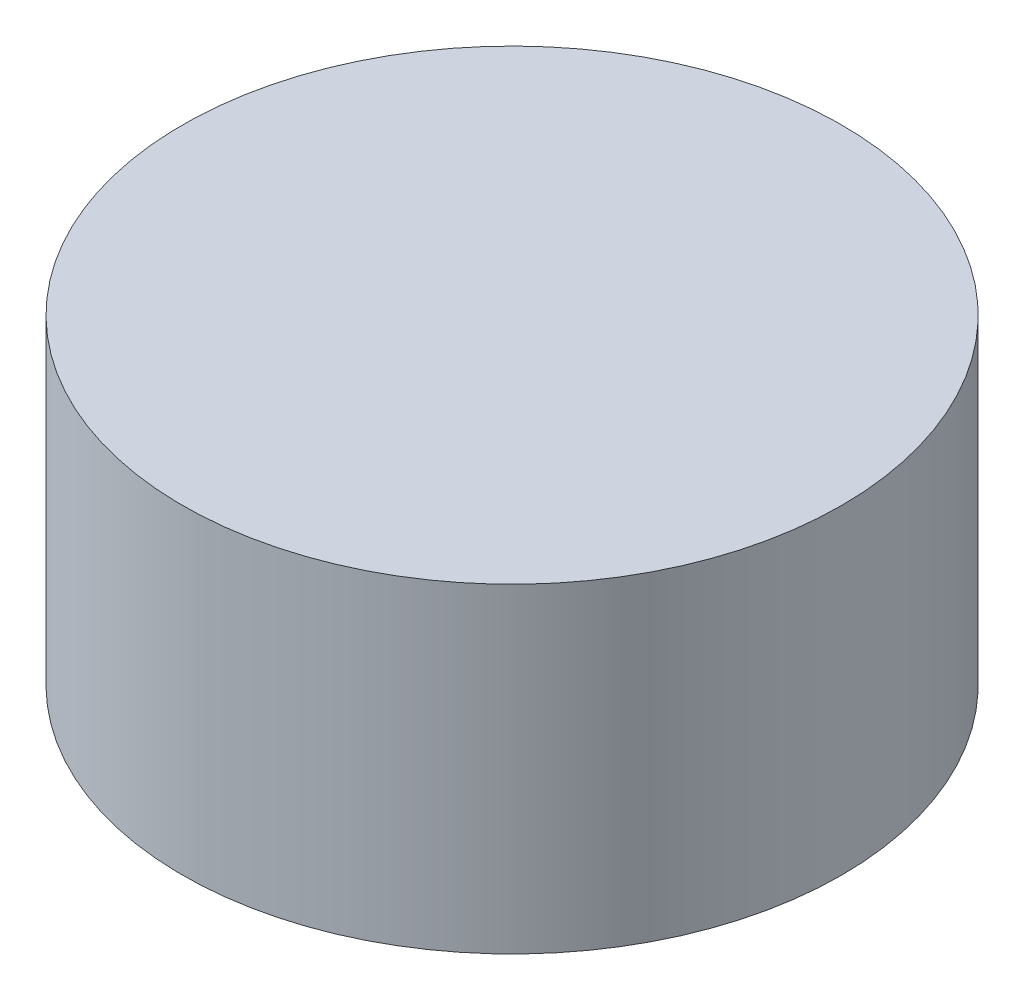
ISO-10303-21;
HEADER;
FILE_DESCRIPTION(('STEP AP214'),'2;1');
FILE_NAME('part.step','',(''),(''),'','','');
FILE_SCHEMA(('AUTOMOTIVE_DESIGN { 1 0 10303 214 1 1 1 1 }'));
ENDSEC;
DATA;
#1=APPLICATION_CONTEXT('core data for automotive mechanical design processes');
#2=APPLICATION_PROTOCOL_DEFINITION('international standard','automotive_design',2000,#1);
#3=PRODUCT_CONTEXT('',#1,'mechanical');
#4=PRODUCT('Part','Part','',(#3));
#5=PRODUCT_RELATED_PRODUCT_CATEGORY('part','',(#4));
#6=PRODUCT_DEFINITION_FORMATION('','',#4);
#7=PRODUCT_DEFINITION_CONTEXT('part definition',#1,'design');
#8=PRODUCT_DEFINITION('design','',#6,#7);
#9=PRODUCT_DEFINITION_SHAPE('','',#8);
#10=(LENGTH_UNIT() NAMED_UNIT(*) SI_UNIT(.MILLI.,.METRE.));
#11=(NAMED_UNIT(*) PLANE_ANGLE_UNIT() SI_UNIT($,.RADIAN.));
#12=(NAMED_UNIT(*) SI_UNIT($,.STERADIAN.) SOLID_ANGLE_UNIT());
#13=UNCERTAINTY_MEASURE_WITH_UNIT(LENGTH_MEASURE(1.E-05),#10,'distance_accuracy_value','');
#14=(GEOMETRIC_REPRESENTATION_CONTEXT(3) GLOBAL_UNCERTAINTY_ASSIGNED_CONTEXT((#13)) GLOBAL_UNIT_ASSIGNED_CONTEXT((#10,
#11,#12)) REPRESENTATION_CONTEXT('',''));
#15=CARTESIAN_POINT('',(0.,0.,0.));
#16=DIRECTION('',(0.,0.,1.));
#17=DIRECTION('',(1.,0.,0.));
#18=AXIS2_PLACEMENT_3D('',#15,#16,#17);
#19=CARTESIAN_POINT('',(0.,0.,0.));
#20=DIRECTION('',(0.,1.,0.));
#21=DIRECTION('',(-1.,0.,0.));
#22=AXIS2_PLACEMENT_3D('',#19,#20,#21);
#23=PLANE('',#22);
#24=CARTESIAN_POINT('',(0.,0.,0.));
#25=DIRECTION('',(0.,-1.,0.));
#26=DIRECTION('',(1.,0.,0.));
#27=AXIS2_PLACEMENT_3D('',#24,#25,#26);
#28=CIRCLE('',#27,7.75);
#29=CARTESIAN_POINT('',(7.75,0.,0.));
#30=VERTEX_POINT('',#29);
#31=EDGE_CURVE('E18',#30,#30,#28,.F.);
#32=ORIENTED_EDGE('',*,*,#31,.F.);
#33=EDGE_LOOP('',(#32));
#34=FACE_BOUND('',#33,.T.);
#35=ADVANCED_FACE('F15',(#34),#23,.F.);
#36=CARTESIAN_POINT('',(0.,7.53000000000001,0.));
#37=DIRECTION('',(0.,-1.,0.));
#38=DIRECTION('',(1.,0.,0.));
#39=AXIS2_PLACEMENT_3D('',#36,#37,#38);
#40=CYLINDRICAL_SURFACE('',#39,7.75);
#41=ORIENTED_EDGE('',*,*,#31,.T.);
#42=EDGE_LOOP('',(#41));
#43=FACE_BOUND('',#42,.T.);
#44=CARTESIAN_POINT('',(0.,7.53000000000001,0.));
#45=DIRECTION('',(0.,-1.,0.));
#46=DIRECTION('',(1.,0.,0.));
#47=AXIS2_PLACEMENT_3D('',#44,#45,#46);
#48=CIRCLE('',#47,7.75);
#49=CARTESIAN_POINT('',(7.75,7.53000000000001,0.));
#50=VERTEX_POINT('',#49);
#51=EDGE_CURVE('E10',#50,#50,#48,.F.);
#52=ORIENTED_EDGE('',*,*,#51,.F.);
#53=EDGE_LOOP('',(#52));
#54=FACE_BOUND('',#53,.T.);
#55=ADVANCED_FACE('F27',(#43,#54),#40,.T.);
#56=CARTESIAN_POINT('',(0.,7.53000000000001,0.));
#57=DIRECTION('',(0.,1.,0.));
#58=DIRECTION('',(-1.,0.,0.));
#59=AXIS2_PLACEMENT_3D('',#56,#57,#58);
#60=PLANE('',#59);
#61=ORIENTED_EDGE('',*,*,#51,.T.);
#62=EDGE_LOOP('',(#61));
#63=FACE_BOUND('',#62,.T.);
#64=ADVANCED_FACE('F35',(#63),#60,.T.);
#65=CLOSED_SHELL('',(#35,#55,#64));
#66=MANIFOLD_SOLID_BREP('B1',#65);
#67=ADVANCED_BREP_SHAPE_REPRESENTATION('',(#18,#66),#14);
#68=SHAPE_DEFINITION_REPRESENTATION(#9,#67);
ENDSEC;
END-ISO-10303-21;
